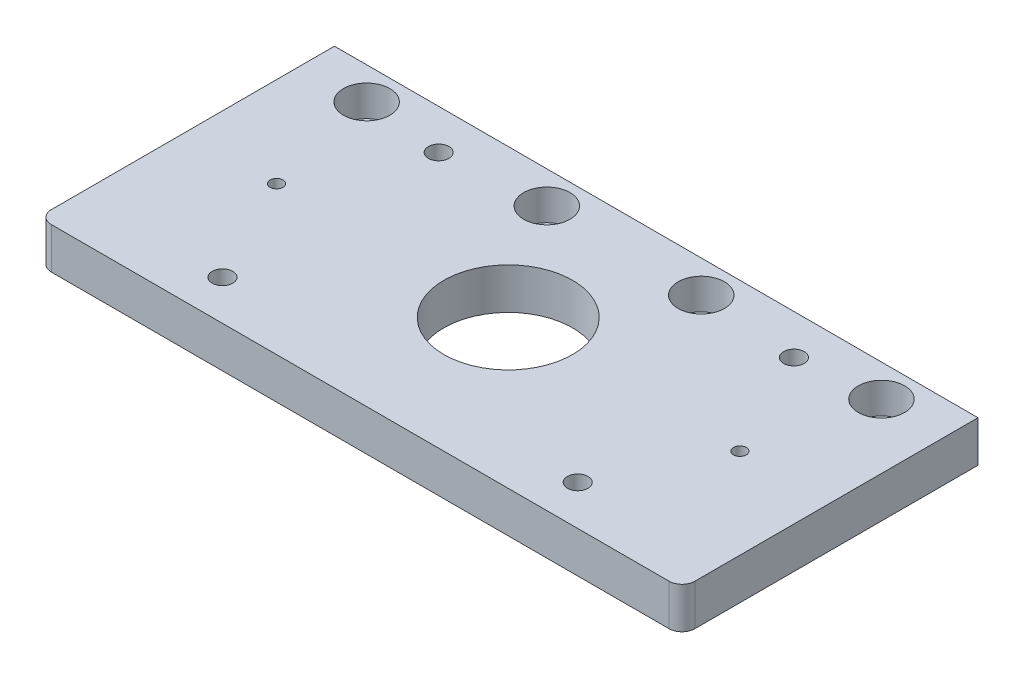
ISO-10303-21;
HEADER;
FILE_DESCRIPTION(('STEP AP214'),'2;1');
FILE_NAME('part.step','',(''),(''),'','','');
FILE_SCHEMA(('AUTOMOTIVE_DESIGN { 1 0 10303 214 1 1 1 1 }'));
ENDSEC;
DATA;
#1=APPLICATION_CONTEXT('core data for automotive mechanical design processes');
#2=APPLICATION_PROTOCOL_DEFINITION('international standard','automotive_design',2000,#1);
#3=PRODUCT_CONTEXT('',#1,'mechanical');
#4=PRODUCT('Part','Part','',(#3));
#5=PRODUCT_RELATED_PRODUCT_CATEGORY('part','',(#4));
#6=PRODUCT_DEFINITION_FORMATION('','',#4);
#7=PRODUCT_DEFINITION_CONTEXT('part definition',#1,'design');
#8=PRODUCT_DEFINITION('design','',#6,#7);
#9=PRODUCT_DEFINITION_SHAPE('','',#8);
#10=(LENGTH_UNIT() NAMED_UNIT(*) SI_UNIT(.MILLI.,.METRE.));
#11=(NAMED_UNIT(*) PLANE_ANGLE_UNIT() SI_UNIT($,.RADIAN.));
#12=(NAMED_UNIT(*) SI_UNIT($,.STERADIAN.) SOLID_ANGLE_UNIT());
#13=UNCERTAINTY_MEASURE_WITH_UNIT(LENGTH_MEASURE(1.E-05),#10,'distance_accuracy_value','');
#14=(GEOMETRIC_REPRESENTATION_CONTEXT(3) GLOBAL_UNCERTAINTY_ASSIGNED_CONTEXT((#13)) GLOBAL_UNIT_ASSIGNED_CONTEXT((#10,
#11,#12)) REPRESENTATION_CONTEXT('',''));
#15=CARTESIAN_POINT('',(0.,0.,0.));
#16=DIRECTION('',(0.,0.,1.));
#17=DIRECTION('',(1.,0.,0.));
#18=AXIS2_PLACEMENT_3D('',#15,#16,#17);
#19=CARTESIAN_POINT('',(90.,-25.,0.));
#20=DIRECTION('',(0.,1.,0.));
#21=DIRECTION('',(0.,0.,1.));
#22=AXIS2_PLACEMENT_3D('',#19,#20,#21);
#23=CYLINDRICAL_SURFACE('',#22,2.5);
#24=CARTESIAN_POINT('',(90.,16.,0.));
#25=DIRECTION('',(0.,1.,0.));
#26=DIRECTION('',(0.,0.,1.));
#27=AXIS2_PLACEMENT_3D('',#24,#25,#26);
#28=CIRCLE('',#27,2.5);
#29=CARTESIAN_POINT('',(90.,16.,2.5));
#30=VERTEX_POINT('',#29);
#31=EDGE_CURVE('E165',#30,#30,#28,.T.);
#32=CARTESIAN_POINT('',(90.,12.,0.));
#33=DIRECTION('',(0.,-1.,0.));
#34=DIRECTION('',(0.,0.,-1.));
#35=AXIS2_PLACEMENT_3D('',#32,#33,#34);
#36=CIRCLE('',#35,2.5);
#37=CARTESIAN_POINT('',(90.,12.,2.5));
#38=VERTEX_POINT('',#37);
#39=EDGE_CURVE('E45',#38,#38,#36,.F.);
#40=CARTESIAN_POINT('',(90.,16.,2.5));
#41=CARTESIAN_POINT('',(90.,15.9583333333333,2.5));
#42=CARTESIAN_POINT('',(90.,15.9166666666667,2.5));
#43=CARTESIAN_POINT('',(90.,15.8333333333333,2.5));
#44=CARTESIAN_POINT('',(90.,15.7916666666667,2.5));
#45=CARTESIAN_POINT('',(90.,15.7083333333333,2.5));
#46=CARTESIAN_POINT('',(90.,15.6666666666667,2.5));
#47=CARTESIAN_POINT('',(90.,15.5833333333333,2.5));
#48=CARTESIAN_POINT('',(90.,15.5416666666667,2.5));
#49=CARTESIAN_POINT('',(90.,15.4583333333333,2.5));
#50=CARTESIAN_POINT('',(90.,15.4166666666667,2.5));
#51=CARTESIAN_POINT('',(90.,15.3333333333333,2.5));
#52=CARTESIAN_POINT('',(90.,15.2916666666667,2.5));
#53=CARTESIAN_POINT('',(90.,15.2083333333333,2.5));
#54=CARTESIAN_POINT('',(90.,15.1666666666667,2.5));
#55=CARTESIAN_POINT('',(90.,15.0833333333333,2.5));
#56=CARTESIAN_POINT('',(90.,15.0416666666667,2.5));
#57=CARTESIAN_POINT('',(90.,14.9583333333333,2.5));
#58=CARTESIAN_POINT('',(90.,14.9166666666667,2.5));
#59=CARTESIAN_POINT('',(90.,14.8333333333333,2.5));
#60=CARTESIAN_POINT('',(90.,14.7916666666667,2.5));
#61=CARTESIAN_POINT('',(90.,14.7083333333333,2.5));
#62=CARTESIAN_POINT('',(90.,14.6666666666667,2.5));
#63=CARTESIAN_POINT('',(90.,14.5833333333333,2.5));
#64=CARTESIAN_POINT('',(90.,14.5416666666667,2.5));
#65=CARTESIAN_POINT('',(90.,14.4583333333333,2.5));
#66=CARTESIAN_POINT('',(90.,14.4166666666667,2.5));
#67=CARTESIAN_POINT('',(90.,14.3333333333333,2.5));
#68=CARTESIAN_POINT('',(90.,14.2916666666667,2.5));
#69=CARTESIAN_POINT('',(90.,14.2083333333333,2.5));
#70=CARTESIAN_POINT('',(90.,14.1666666666667,2.5));
#71=CARTESIAN_POINT('',(90.,14.0833333333333,2.5));
#72=CARTESIAN_POINT('',(90.,14.0416666666667,2.5));
#73=CARTESIAN_POINT('',(90.,13.9583333333333,2.5));
#74=CARTESIAN_POINT('',(90.,13.9166666666667,2.5));
#75=CARTESIAN_POINT('',(90.,13.8333333333333,2.5));
#76=CARTESIAN_POINT('',(90.,13.7916666666667,2.5));
#77=CARTESIAN_POINT('',(90.,13.7083333333333,2.5));
#78=CARTESIAN_POINT('',(90.,13.6666666666667,2.5));
#79=CARTESIAN_POINT('',(90.,13.5833333333333,2.5));
#80=CARTESIAN_POINT('',(90.,13.5416666666667,2.5));
#81=CARTESIAN_POINT('',(90.,13.4583333333333,2.5));
#82=CARTESIAN_POINT('',(90.,13.4166666666667,2.5));
#83=CARTESIAN_POINT('',(90.,13.3333333333333,2.5));
#84=CARTESIAN_POINT('',(90.,13.2916666666667,2.5));
#85=CARTESIAN_POINT('',(90.,13.2083333333333,2.5));
#86=CARTESIAN_POINT('',(90.,13.1666666666667,2.5));
#87=CARTESIAN_POINT('',(90.,13.0833333333333,2.5));
#88=CARTESIAN_POINT('',(90.,13.0416666666667,2.5));
#89=CARTESIAN_POINT('',(90.,12.9583333333333,2.5));
#90=CARTESIAN_POINT('',(90.,12.9166666666667,2.5));
#91=CARTESIAN_POINT('',(90.,12.8333333333333,2.5));
#92=CARTESIAN_POINT('',(90.,12.7916666666667,2.5));
#93=CARTESIAN_POINT('',(90.,12.7083333333333,2.5));
#94=CARTESIAN_POINT('',(90.,12.6666666666667,2.5));
#95=CARTESIAN_POINT('',(90.,12.5833333333333,2.5));
#96=CARTESIAN_POINT('',(90.,12.5416666666667,2.5));
#97=CARTESIAN_POINT('',(90.,12.4583333333333,2.5));
#98=CARTESIAN_POINT('',(90.,12.4166666666667,2.5));
#99=CARTESIAN_POINT('',(90.,12.3333333333333,2.5));
#100=CARTESIAN_POINT('',(90.,12.2916666666667,2.5));
#101=CARTESIAN_POINT('',(90.,12.2083333333333,2.5));
#102=CARTESIAN_POINT('',(90.,12.1666666666667,2.5));
#103=CARTESIAN_POINT('',(90.,12.0833333333333,2.5));
#104=CARTESIAN_POINT('',(90.,12.0416666666667,2.5));
#105=CARTESIAN_POINT('',(90.,12.,2.5));
#106=B_SPLINE_CURVE_WITH_KNOTS('',3,(#40,#41,#42,#43,#44,#45,#46,#47,#48,#49,#50,#51,#52,#53,
#54,#55,#56,#57,#58,#59,#60,#61,#62,#63,#64,#65,#66,#67,#68,#69,#70,#71,#72,#73,#74,#75,#76,#77,
#78,#79,#80,#81,#82,#83,#84,#85,#86,#87,#88,#89,#90,#91,#92,#93,#94,#95,#96,#97,#98,#99,#100,
#101,#102,#103,#104,#105),.UNSPECIFIED.,.F.,.F.,(4,2,2,2,2,2,2,2,2,2,2,2,2,2,2,2,2,2,2,2,2,2,2,
2,2,2,2,2,2,2,2,2,4),(0.,0.125,0.25,0.375,0.5,0.625000000000001,0.750000000000001,
0.875000000000001,1.,1.12499999999999,1.24999999999999,1.37499999999999,1.49999999999999,
1.62499999999999,1.74999999999999,1.87499999999999,1.99999999999999,2.125,2.25,2.375,2.5,2.625,
2.75,2.875,2.99999999999999,3.12499999999999,3.24999999999999,3.37499999999999,3.49999999999999,
3.62499999999999,3.74999999999999,3.87499999999999,3.99999999999999),.UNSPECIFIED.);
#107=EDGE_CURVE('BSEAM41',#30,#38,#106,.T.);
#108=ORIENTED_EDGE('',*,*,#31,.T.);
#109=ORIENTED_EDGE('',*,*,#39,.F.);
#110=ORIENTED_EDGE('',*,*,#107,.T.);
#111=ORIENTED_EDGE('',*,*,#107,.F.);
#112=EDGE_LOOP('',(#108,#110,#109,#111));
#113=FACE_BOUND('',#112,.T.);
#114=ADVANCED_FACE('F41',(#113),#23,.F.);
#115=CARTESIAN_POINT('',(-90.,-25.,0.));
#116=DIRECTION('',(0.,1.,0.));
#117=DIRECTION('',(0.,0.,1.));
#118=AXIS2_PLACEMENT_3D('',#115,#116,#117);
#119=CYLINDRICAL_SURFACE('',#118,2.5);
#120=CARTESIAN_POINT('',(-90.,16.,0.));
#121=DIRECTION('',(0.,1.,0.));
#122=DIRECTION('',(0.,0.,1.));
#123=AXIS2_PLACEMENT_3D('',#120,#121,#122);
#124=CIRCLE('',#123,2.5);
#125=CARTESIAN_POINT('',(-90.,16.,2.50000000000001));
#126=VERTEX_POINT('',#125);
#127=EDGE_CURVE('E180',#126,#126,#124,.T.);
#128=CARTESIAN_POINT('',(-90.,12.,0.));
#129=DIRECTION('',(0.,-1.,0.));
#130=DIRECTION('',(0.,0.,-1.));
#131=AXIS2_PLACEMENT_3D('',#128,#129,#130);
#132=CIRCLE('',#131,2.5);
#133=CARTESIAN_POINT('',(-90.,12.,2.50000000000001));
#134=VERTEX_POINT('',#133);
#135=EDGE_CURVE('E159',#134,#134,#132,.F.);
#136=CARTESIAN_POINT('',(-90.,16.,2.50000000000001));
#137=CARTESIAN_POINT('',(-90.,15.9583333333333,2.50000000000001));
#138=CARTESIAN_POINT('',(-90.,15.9166666666667,2.50000000000001));
#139=CARTESIAN_POINT('',(-90.,15.8333333333333,2.50000000000001));
#140=CARTESIAN_POINT('',(-90.,15.7916666666667,2.50000000000001));
#141=CARTESIAN_POINT('',(-90.,15.7083333333333,2.50000000000001));
#142=CARTESIAN_POINT('',(-90.,15.6666666666667,2.50000000000001));
#143=CARTESIAN_POINT('',(-90.,15.5833333333333,2.50000000000001));
#144=CARTESIAN_POINT('',(-90.,15.5416666666667,2.50000000000001));
#145=CARTESIAN_POINT('',(-90.,15.4583333333333,2.50000000000001));
#146=CARTESIAN_POINT('',(-90.,15.4166666666667,2.50000000000001));
#147=CARTESIAN_POINT('',(-90.,15.3333333333333,2.50000000000001));
#148=CARTESIAN_POINT('',(-90.,15.2916666666667,2.50000000000001));
#149=CARTESIAN_POINT('',(-90.,15.2083333333333,2.50000000000001));
#150=CARTESIAN_POINT('',(-90.,15.1666666666667,2.50000000000001));
#151=CARTESIAN_POINT('',(-90.,15.0833333333333,2.50000000000001));
#152=CARTESIAN_POINT('',(-90.,15.0416666666667,2.50000000000001));
#153=CARTESIAN_POINT('',(-90.,14.9583333333333,2.50000000000001));
#154=CARTESIAN_POINT('',(-90.,14.9166666666667,2.50000000000001));
#155=CARTESIAN_POINT('',(-90.,14.8333333333333,2.50000000000001));
#156=CARTESIAN_POINT('',(-90.,14.7916666666667,2.50000000000001));
#157=CARTESIAN_POINT('',(-90.,14.7083333333333,2.50000000000001));
#158=CARTESIAN_POINT('',(-90.,14.6666666666667,2.50000000000001));
#159=CARTESIAN_POINT('',(-90.,14.5833333333333,2.50000000000001));
#160=CARTESIAN_POINT('',(-90.,14.5416666666667,2.50000000000001));
#161=CARTESIAN_POINT('',(-90.,14.4583333333333,2.50000000000001));
#162=CARTESIAN_POINT('',(-90.,14.4166666666667,2.50000000000001));
#163=CARTESIAN_POINT('',(-90.,14.3333333333333,2.50000000000001));
#164=CARTESIAN_POINT('',(-90.,14.2916666666667,2.50000000000001));
#165=CARTESIAN_POINT('',(-90.,14.2083333333333,2.50000000000001));
#166=CARTESIAN_POINT('',(-90.,14.1666666666667,2.50000000000001));
#167=CARTESIAN_POINT('',(-90.,14.0833333333333,2.50000000000001));
#168=CARTESIAN_POINT('',(-90.,14.0416666666667,2.50000000000001));
#169=CARTESIAN_POINT('',(-90.,13.9583333333333,2.50000000000001));
#170=CARTESIAN_POINT('',(-90.,13.9166666666667,2.50000000000001));
#171=CARTESIAN_POINT('',(-90.,13.8333333333333,2.50000000000001));
#172=CARTESIAN_POINT('',(-90.,13.7916666666667,2.50000000000001));
#173=CARTESIAN_POINT('',(-90.,13.7083333333333,2.50000000000001));
#174=CARTESIAN_POINT('',(-90.,13.6666666666667,2.50000000000001));
#175=CARTESIAN_POINT('',(-90.,13.5833333333333,2.50000000000001));
#176=CARTESIAN_POINT('',(-90.,13.5416666666667,2.50000000000001));
#177=CARTESIAN_POINT('',(-90.,13.4583333333333,2.50000000000001));
#178=CARTESIAN_POINT('',(-90.,13.4166666666667,2.50000000000001));
#179=CARTESIAN_POINT('',(-90.,13.3333333333333,2.50000000000001));
#180=CARTESIAN_POINT('',(-90.,13.2916666666667,2.50000000000001));
#181=CARTESIAN_POINT('',(-90.,13.2083333333333,2.50000000000001));
#182=CARTESIAN_POINT('',(-90.,13.1666666666667,2.50000000000001));
#183=CARTESIAN_POINT('',(-90.,13.0833333333333,2.50000000000001));
#184=CARTESIAN_POINT('',(-90.,13.0416666666667,2.50000000000001));
#185=CARTESIAN_POINT('',(-90.,12.9583333333333,2.50000000000001));
#186=CARTESIAN_POINT('',(-90.,12.9166666666667,2.50000000000001));
#187=CARTESIAN_POINT('',(-90.,12.8333333333333,2.50000000000001));
#188=CARTESIAN_POINT('',(-90.,12.7916666666667,2.50000000000001));
#189=CARTESIAN_POINT('',(-90.,12.7083333333333,2.50000000000001));
#190=CARTESIAN_POINT('',(-90.,12.6666666666667,2.50000000000001));
#191=CARTESIAN_POINT('',(-90.,12.5833333333333,2.50000000000001));
#192=CARTESIAN_POINT('',(-90.,12.5416666666667,2.50000000000001));
#193=CARTESIAN_POINT('',(-90.,12.4583333333333,2.50000000000001));
#194=CARTESIAN_POINT('',(-90.,12.4166666666667,2.50000000000001));
#195=CARTESIAN_POINT('',(-90.,12.3333333333333,2.50000000000001));
#196=CARTESIAN_POINT('',(-90.,12.2916666666667,2.50000000000001));
#197=CARTESIAN_POINT('',(-90.,12.2083333333333,2.50000000000001));
#198=CARTESIAN_POINT('',(-90.,12.1666666666667,2.50000000000001));
#199=CARTESIAN_POINT('',(-90.,12.0833333333333,2.50000000000001));
#200=CARTESIAN_POINT('',(-90.,12.0416666666667,2.50000000000001));
#201=CARTESIAN_POINT('',(-90.,12.,2.50000000000001));
#202=B_SPLINE_CURVE_WITH_KNOTS('',3,(#136,#137,#138,#139,#140,#141,#142,#143,#144,#145,#146,
#147,#148,#149,#150,#151,#152,#153,#154,#155,#156,#157,#158,#159,#160,#161,#162,#163,#164,#165,
#166,#167,#168,#169,#170,#171,#172,#173,#174,#175,#176,#177,#178,#179,#180,#181,#182,#183,#184,
#185,#186,#187,#188,#189,#190,#191,#192,#193,#194,#195,#196,#197,#198,#199,#200,#201),
.UNSPECIFIED.,.F.,.F.,(4,2,2,2,2,2,2,2,2,2,2,2,2,2,2,2,2,2,2,2,2,2,2,2,2,2,2,2,2,2,2,2,4),(0.,
0.125,0.25,0.375,0.5,0.625000000000001,0.750000000000001,0.875000000000001,1.,1.12499999999999,
1.24999999999999,1.37499999999999,1.49999999999999,1.62499999999999,1.74999999999999,
1.87499999999999,1.99999999999999,2.125,2.25,2.375,2.5,2.625,2.75,2.875,2.99999999999999,
3.12499999999999,3.24999999999999,3.37499999999999,3.49999999999999,3.62499999999999,
3.74999999999999,3.87499999999999,3.99999999999999),.UNSPECIFIED.);
#203=EDGE_CURVE('BSEAM274',#126,#134,#202,.T.);
#204=ORIENTED_EDGE('',*,*,#127,.T.);
#205=ORIENTED_EDGE('',*,*,#135,.F.);
#206=ORIENTED_EDGE('',*,*,#203,.T.);
#207=ORIENTED_EDGE('',*,*,#203,.F.);
#208=EDGE_LOOP('',(#204,#206,#205,#207));
#209=FACE_BOUND('',#208,.T.);
#210=ADVANCED_FACE('F274',(#209),#119,.F.);
#211=CARTESIAN_POINT('',(-100.,16.,-45.));
#212=DIRECTION('',(0.,-1.,0.));
#213=DIRECTION('',(0.,0.,-1.));
#214=AXIS2_PLACEMENT_3D('',#211,#212,#213);
#215=CYLINDRICAL_SURFACE('',#214,6.);
#216=CARTESIAN_POINT('',(-100.,0.,-45.));
#217=DIRECTION('',(0.,1.,0.));
#218=DIRECTION('',(0.,0.,-1.));
#219=AXIS2_PLACEMENT_3D('',#216,#217,#218);
#220=CIRCLE('',#219,6.);
#221=CARTESIAN_POINT('',(-100.,0.,-51.));
#222=VERTEX_POINT('',#221);
#223=EDGE_CURVE('E210',#222,#222,#220,.T.);
#224=ORIENTED_EDGE('',*,*,#223,.F.);
#225=EDGE_LOOP('',(#224));
#226=FACE_BOUND('',#225,.T.);
#227=CARTESIAN_POINT('',(-100.,4.,-45.));
#228=DIRECTION('',(0.,1.,0.));
#229=DIRECTION('',(0.,0.,1.));
#230=AXIS2_PLACEMENT_3D('',#227,#228,#229);
#231=CIRCLE('',#230,6.);
#232=CARTESIAN_POINT('',(-100.,4.,-39.));
#233=VERTEX_POINT('',#232);
#234=EDGE_CURVE('E149',#233,#233,#231,.T.);
#235=ORIENTED_EDGE('',*,*,#234,.T.);
#236=EDGE_LOOP('',(#235));
#237=FACE_BOUND('',#236,.T.);
#238=ADVANCED_FACE('F281',(#226,#237),#215,.F.);
#239=CARTESIAN_POINT('',(-30.,16.,-45.));
#240=DIRECTION('',(0.,-1.,0.));
#241=DIRECTION('',(0.,0.,-1.));
#242=AXIS2_PLACEMENT_3D('',#239,#240,#241);
#243=CYLINDRICAL_SURFACE('',#242,6.);
#244=CARTESIAN_POINT('',(-30.,0.,-45.));
#245=DIRECTION('',(0.,1.,0.));
#246=DIRECTION('',(0.,0.,-1.));
#247=AXIS2_PLACEMENT_3D('',#244,#245,#246);
#248=CIRCLE('',#247,6.);
#249=CARTESIAN_POINT('',(-30.,0.,-51.));
#250=VERTEX_POINT('',#249);
#251=EDGE_CURVE('E158',#250,#250,#248,.T.);
#252=ORIENTED_EDGE('',*,*,#251,.F.);
#253=EDGE_LOOP('',(#252));
#254=FACE_BOUND('',#253,.T.);
#255=CARTESIAN_POINT('',(-30.,4.,-45.));
#256=DIRECTION('',(0.,1.,0.));
#257=DIRECTION('',(0.,0.,1.));
#258=AXIS2_PLACEMENT_3D('',#255,#256,#257);
#259=CIRCLE('',#258,6.);
#260=CARTESIAN_POINT('',(-30.,4.,-39.));
#261=VERTEX_POINT('',#260);
#262=EDGE_CURVE('E146',#261,#261,#259,.T.);
#263=ORIENTED_EDGE('',*,*,#262,.T.);
#264=EDGE_LOOP('',(#263));
#265=FACE_BOUND('',#264,.T.);
#266=ADVANCED_FACE('F321',(#254,#265),#243,.F.);
#267=CARTESIAN_POINT('',(-120.,16.,52.5));
#268=DIRECTION('',(0.,1.,0.));
#269=DIRECTION('',(0.,0.,1.));
#270=AXIS2_PLACEMENT_3D('',#267,#268,#269);
#271=PLANE('',#270);
#272=ORIENTED_EDGE('',*,*,#127,.F.);
#273=EDGE_LOOP('',(#272));
#274=FACE_BOUND('',#273,.T.);
#275=ORIENTED_EDGE('',*,*,#31,.F.);
#276=EDGE_LOOP('',(#275));
#277=FACE_BOUND('',#276,.T.);
#278=CARTESIAN_POINT('',(-100.,16.,-45.));
#279=DIRECTION('',(0.,1.,0.));
#280=DIRECTION('',(0.,0.,1.));
#281=AXIS2_PLACEMENT_3D('',#278,#279,#280);
#282=CIRCLE('',#281,9.);
#283=CARTESIAN_POINT('',(-100.,16.,-36.));
#284=VERTEX_POINT('',#283);
#285=EDGE_CURVE('E188',#284,#284,#282,.T.);
#286=ORIENTED_EDGE('',*,*,#285,.F.);
#287=EDGE_LOOP('',(#286));
#288=FACE_BOUND('',#287,.T.);
#289=CARTESIAN_POINT('',(-30.,16.,-45.));
#290=DIRECTION('',(0.,1.,0.));
#291=DIRECTION('',(0.,0.,1.));
#292=AXIS2_PLACEMENT_3D('',#289,#290,#291);
#293=CIRCLE('',#292,9.);
#294=CARTESIAN_POINT('',(-30.,16.,-36.));
#295=VERTEX_POINT('',#294);
#296=EDGE_CURVE('E191',#295,#295,#293,.T.);
#297=ORIENTED_EDGE('',*,*,#296,.F.);
#298=EDGE_LOOP('',(#297));
#299=FACE_BOUND('',#298,.T.);
#300=CARTESIAN_POINT('',(30.,16.,-45.));
#301=DIRECTION('',(0.,1.,0.));
#302=DIRECTION('',(0.,0.,-1.));
#303=AXIS2_PLACEMENT_3D('',#300,#301,#302);
#304=CIRCLE('',#303,9.);
#305=CARTESIAN_POINT('',(30.,16.,-54.));
#306=VERTEX_POINT('',#305);
#307=EDGE_CURVE('E197',#306,#306,#304,.T.);
#308=ORIENTED_EDGE('',*,*,#307,.F.);
#309=EDGE_LOOP('',(#308));
#310=FACE_BOUND('',#309,.T.);
#311=CARTESIAN_POINT('',(100.,16.,-45.));
#312=DIRECTION('',(0.,1.,0.));
#313=DIRECTION('',(0.,0.,-1.));
#314=AXIS2_PLACEMENT_3D('',#311,#312,#313);
#315=CIRCLE('',#314,9.);
#316=CARTESIAN_POINT('',(100.,16.,-54.));
#317=VERTEX_POINT('',#316);
#318=EDGE_CURVE('E203',#317,#317,#315,.T.);
#319=ORIENTED_EDGE('',*,*,#318,.F.);
#320=EDGE_LOOP('',(#319));
#321=FACE_BOUND('',#320,.T.);
#322=CARTESIAN_POINT('',(-69.,16.,42.));
#323=DIRECTION('',(0.,1.,0.));
#324=DIRECTION('',(0.,0.,-1.));
#325=AXIS2_PLACEMENT_3D('',#322,#323,#324);
#326=CIRCLE('',#325,4.00000000000001);
#327=CARTESIAN_POINT('',(-69.,16.,38.));
#328=VERTEX_POINT('',#327);
#329=EDGE_CURVE('E226',#328,#328,#326,.T.);
#330=ORIENTED_EDGE('',*,*,#329,.F.);
#331=EDGE_LOOP('',(#330));
#332=FACE_BOUND('',#331,.T.);
#333=CARTESIAN_POINT('',(69.,16.,42.));
#334=DIRECTION('',(0.,1.,0.));
#335=DIRECTION('',(0.,0.,1.));
#336=AXIS2_PLACEMENT_3D('',#333,#334,#335);
#337=CIRCLE('',#336,4.00000000000001);
#338=CARTESIAN_POINT('',(69.,16.,46.));
#339=VERTEX_POINT('',#338);
#340=EDGE_CURVE('E238',#339,#339,#337,.T.);
#341=ORIENTED_EDGE('',*,*,#340,.F.);
#342=EDGE_LOOP('',(#341));
#343=FACE_BOUND('',#342,.T.);
#344=DIRECTION('',(0.,0.,1.));
#345=VECTOR('',#344,1.);
#346=CARTESIAN_POINT('',(-125.,16.,-57.5));
#347=LINE('',#346,#345);
#348=CARTESIAN_POINT('',(-125.,16.,-57.5));
#349=VERTEX_POINT('',#348);
#350=CARTESIAN_POINT('',(-125.,16.,52.5));
#351=VERTEX_POINT('',#350);
#352=EDGE_CURVE('E140',#349,#351,#347,.T.);
#353=ORIENTED_EDGE('',*,*,#352,.T.);
#354=CARTESIAN_POINT('',(-120.,16.,52.5));
#355=DIRECTION('',(0.,1.,0.));
#356=DIRECTION('',(0.,0.,1.));
#357=AXIS2_PLACEMENT_3D('',#354,#355,#356);
#358=CIRCLE('',#357,5.);
#359=CARTESIAN_POINT('',(-120.,16.,57.5));
#360=VERTEX_POINT('',#359);
#361=EDGE_CURVE('E97',#351,#360,#358,.T.);
#362=ORIENTED_EDGE('',*,*,#361,.T.);
#363=DIRECTION('',(1.,0.,0.));
#364=VECTOR('',#363,1.);
#365=CARTESIAN_POINT('',(-120.,16.,57.5));
#366=LINE('',#365,#364);
#367=CARTESIAN_POINT('',(120.,16.,57.5));
#368=VERTEX_POINT('',#367);
#369=EDGE_CURVE('E111',#360,#368,#366,.T.);
#370=ORIENTED_EDGE('',*,*,#369,.T.);
#371=CARTESIAN_POINT('',(120.,16.,52.5));
#372=DIRECTION('',(0.,1.,0.));
#373=DIRECTION('',(0.,0.,1.));
#374=AXIS2_PLACEMENT_3D('',#371,#372,#373);
#375=CIRCLE('',#374,5.);
#376=CARTESIAN_POINT('',(125.,16.,52.5));
#377=VERTEX_POINT('',#376);
#378=EDGE_CURVE('E104',#368,#377,#375,.T.);
#379=ORIENTED_EDGE('',*,*,#378,.T.);
#380=DIRECTION('',(0.,0.,-1.));
#381=VECTOR('',#380,1.);
#382=CARTESIAN_POINT('',(125.,16.,-57.5));
#383=LINE('',#382,#381);
#384=CARTESIAN_POINT('',(125.,16.,-57.5));
#385=VERTEX_POINT('',#384);
#386=EDGE_CURVE('E109',#377,#385,#383,.T.);
#387=ORIENTED_EDGE('',*,*,#386,.T.);
#388=DIRECTION('',(-1.,0.,0.));
#389=VECTOR('',#388,1.);
#390=CARTESIAN_POINT('',(-125.,16.,-57.5));
#391=LINE('',#390,#389);
#392=EDGE_CURVE('E60',#385,#349,#391,.T.);
#393=ORIENTED_EDGE('',*,*,#392,.T.);
#394=EDGE_LOOP('',(#353,#362,#370,#379,#387,#393));
#395=FACE_BOUND('',#394,.T.);
#396=CARTESIAN_POINT('',(0.,16.,0.));
#397=DIRECTION('',(0.,1.,0.));
#398=DIRECTION('',(0.,0.,1.));
#399=AXIS2_PLACEMENT_3D('',#396,#397,#398);
#400=CIRCLE('',#399,25.);
#401=CARTESIAN_POINT('',(0.,16.,25.));
#402=VERTEX_POINT('',#401);
#403=EDGE_CURVE('E133',#402,#402,#400,.T.);
#404=ORIENTED_EDGE('',*,*,#403,.F.);
#405=EDGE_LOOP('',(#404));
#406=FACE_BOUND('',#405,.T.);
#407=CARTESIAN_POINT('',(69.,16.,-42.));
#408=DIRECTION('',(0.,1.,0.));
#409=DIRECTION('',(0.,0.,-1.));
#410=AXIS2_PLACEMENT_3D('',#407,#408,#409);
#411=CIRCLE('',#410,4.00000000000001);
#412=CARTESIAN_POINT('',(69.,16.,-46.));
#413=VERTEX_POINT('',#412);
#414=EDGE_CURVE('E232',#413,#413,#411,.T.);
#415=ORIENTED_EDGE('',*,*,#414,.F.);
#416=EDGE_LOOP('',(#415));
#417=FACE_BOUND('',#416,.T.);
#418=CARTESIAN_POINT('',(-69.,16.,-42.));
#419=DIRECTION('',(0.,1.,0.));
#420=DIRECTION('',(0.,0.,1.));
#421=AXIS2_PLACEMENT_3D('',#418,#419,#420);
#422=CIRCLE('',#421,4.00000000000001);
#423=CARTESIAN_POINT('',(-69.,16.,-38.));
#424=VERTEX_POINT('',#423);
#425=EDGE_CURVE('E220',#424,#424,#422,.T.);
#426=ORIENTED_EDGE('',*,*,#425,.F.);
#427=EDGE_LOOP('',(#426));
#428=FACE_BOUND('',#427,.T.);
#429=ADVANCED_FACE('F106',(#274,#277,#288,#299,#310,#321,#332,#343,#395,#406,#417,#428),#271,.T.);
#430=CARTESIAN_POINT('',(-120.,0.,52.5));
#431=DIRECTION('',(0.,1.,0.));
#432=DIRECTION('',(0.,0.,1.));
#433=AXIS2_PLACEMENT_3D('',#430,#431,#432);
#434=PLANE('',#433);
#435=CARTESIAN_POINT('',(-90.,0.,0.));
#436=DIRECTION('',(0.,-1.,0.));
#437=DIRECTION('',(0.,0.,-1.));
#438=AXIS2_PLACEMENT_3D('',#435,#436,#437);
#439=CIRCLE('',#438,12.5);
#440=CARTESIAN_POINT('',(-90.,0.,-12.5));
#441=VERTEX_POINT('',#440);
#442=EDGE_CURVE('E167',#441,#441,#439,.T.);
#443=ORIENTED_EDGE('',*,*,#442,.F.);
#444=EDGE_LOOP('',(#443));
#445=FACE_BOUND('',#444,.T.);
#446=CARTESIAN_POINT('',(90.,0.,0.));
#447=DIRECTION('',(0.,-1.,0.));
#448=DIRECTION('',(0.,0.,-1.));
#449=AXIS2_PLACEMENT_3D('',#446,#447,#448);
#450=CIRCLE('',#449,12.5);
#451=CARTESIAN_POINT('',(90.,0.,-12.5));
#452=VERTEX_POINT('',#451);
#453=EDGE_CURVE('E172',#452,#452,#450,.T.);
#454=ORIENTED_EDGE('',*,*,#453,.F.);
#455=EDGE_LOOP('',(#454));
#456=FACE_BOUND('',#455,.T.);
#457=DIRECTION('',(0.,0.,1.));
#458=VECTOR('',#457,1.);
#459=CARTESIAN_POINT('',(-125.,0.,-57.5));
#460=LINE('',#459,#458);
#461=CARTESIAN_POINT('',(-125.,0.,-57.5));
#462=VERTEX_POINT('',#461);
#463=CARTESIAN_POINT('',(-125.,0.,52.5));
#464=VERTEX_POINT('',#463);
#465=EDGE_CURVE('E129',#462,#464,#460,.T.);
#466=ORIENTED_EDGE('',*,*,#465,.F.);
#467=DIRECTION('',(-1.,0.,0.));
#468=VECTOR('',#467,1.);
#469=CARTESIAN_POINT('',(-125.,0.,-57.5));
#470=LINE('',#469,#468);
#471=CARTESIAN_POINT('',(125.,0.,-57.5));
#472=VERTEX_POINT('',#471);
#473=EDGE_CURVE('E89',#472,#462,#470,.T.);
#474=ORIENTED_EDGE('',*,*,#473,.F.);
#475=DIRECTION('',(0.,0.,-1.));
#476=VECTOR('',#475,1.);
#477=CARTESIAN_POINT('',(125.,0.,-57.5));
#478=LINE('',#477,#476);
#479=CARTESIAN_POINT('',(125.,0.,52.5));
#480=VERTEX_POINT('',#479);
#481=EDGE_CURVE('E83',#480,#472,#478,.T.);
#482=ORIENTED_EDGE('',*,*,#481,.F.);
#483=CARTESIAN_POINT('',(120.,0.,52.5));
#484=DIRECTION('',(0.,1.,0.));
#485=DIRECTION('',(0.,0.,1.));
#486=AXIS2_PLACEMENT_3D('',#483,#484,#485);
#487=CIRCLE('',#486,5.);
#488=CARTESIAN_POINT('',(120.,0.,57.5));
#489=VERTEX_POINT('',#488);
#490=EDGE_CURVE('E119',#489,#480,#487,.T.);
#491=ORIENTED_EDGE('',*,*,#490,.F.);
#492=DIRECTION('',(1.,0.,0.));
#493=VECTOR('',#492,1.);
#494=CARTESIAN_POINT('',(-120.,0.,57.5));
#495=LINE('',#494,#493);
#496=CARTESIAN_POINT('',(-120.,0.,57.5));
#497=VERTEX_POINT('',#496);
#498=EDGE_CURVE('E135',#497,#489,#495,.T.);
#499=ORIENTED_EDGE('',*,*,#498,.F.);
#500=CARTESIAN_POINT('',(-120.,0.,52.5));
#501=DIRECTION('',(0.,1.,0.));
#502=DIRECTION('',(0.,0.,1.));
#503=AXIS2_PLACEMENT_3D('',#500,#501,#502);
#504=CIRCLE('',#503,5.);
#505=EDGE_CURVE('E132',#464,#497,#504,.T.);
#506=ORIENTED_EDGE('',*,*,#505,.F.);
#507=EDGE_LOOP('',(#466,#474,#482,#491,#499,#506));
#508=FACE_BOUND('',#507,.T.);
#509=CARTESIAN_POINT('',(0.,0.,0.));
#510=DIRECTION('',(0.,1.,0.));
#511=DIRECTION('',(0.,0.,1.));
#512=AXIS2_PLACEMENT_3D('',#509,#510,#511);
#513=CIRCLE('',#512,25.);
#514=CARTESIAN_POINT('',(0.,0.,25.));
#515=VERTEX_POINT('',#514);
#516=EDGE_CURVE('E241',#515,#515,#513,.T.);
#517=ORIENTED_EDGE('',*,*,#516,.T.);
#518=EDGE_LOOP('',(#517));
#519=FACE_BOUND('',#518,.T.);
#520=CARTESIAN_POINT('',(69.,0.,42.));
#521=DIRECTION('',(0.,1.,0.));
#522=DIRECTION('',(0.,0.,1.));
#523=AXIS2_PLACEMENT_3D('',#520,#521,#522);
#524=CIRCLE('',#523,4.00000000000001);
#525=CARTESIAN_POINT('',(69.,0.,46.));
#526=VERTEX_POINT('',#525);
#527=EDGE_CURVE('E235',#526,#526,#524,.T.);
#528=ORIENTED_EDGE('',*,*,#527,.T.);
#529=EDGE_LOOP('',(#528));
#530=FACE_BOUND('',#529,.T.);
#531=CARTESIAN_POINT('',(69.,0.,-42.));
#532=DIRECTION('',(0.,1.,0.));
#533=DIRECTION('',(0.,0.,-1.));
#534=AXIS2_PLACEMENT_3D('',#531,#532,#533);
#535=CIRCLE('',#534,4.00000000000001);
#536=CARTESIAN_POINT('',(69.,0.,-46.));
#537=VERTEX_POINT('',#536);
#538=EDGE_CURVE('E229',#537,#537,#535,.T.);
#539=ORIENTED_EDGE('',*,*,#538,.T.);
#540=EDGE_LOOP('',(#539));
#541=FACE_BOUND('',#540,.T.);
#542=CARTESIAN_POINT('',(-69.,0.,42.));
#543=DIRECTION('',(0.,1.,0.));
#544=DIRECTION('',(0.,0.,-1.));
#545=AXIS2_PLACEMENT_3D('',#542,#543,#544);
#546=CIRCLE('',#545,4.00000000000001);
#547=CARTESIAN_POINT('',(-69.,0.,38.));
#548=VERTEX_POINT('',#547);
#549=EDGE_CURVE('E223',#548,#548,#546,.T.);
#550=ORIENTED_EDGE('',*,*,#549,.T.);
#551=EDGE_LOOP('',(#550));
#552=FACE_BOUND('',#551,.T.);
#553=CARTESIAN_POINT('',(-69.,0.,-42.));
#554=DIRECTION('',(0.,1.,0.));
#555=DIRECTION('',(0.,0.,1.));
#556=AXIS2_PLACEMENT_3D('',#553,#554,#555);
#557=CIRCLE('',#556,4.00000000000001);
#558=CARTESIAN_POINT('',(-69.,0.,-38.));
#559=VERTEX_POINT('',#558);
#560=EDGE_CURVE('E219',#559,#559,#557,.T.);
#561=ORIENTED_EDGE('',*,*,#560,.T.);
#562=EDGE_LOOP('',(#561));
#563=FACE_BOUND('',#562,.T.);
#564=CARTESIAN_POINT('',(30.,0.,-45.));
#565=DIRECTION('',(0.,1.,0.));
#566=DIRECTION('',(0.,0.,1.));
#567=AXIS2_PLACEMENT_3D('',#564,#565,#566);
#568=CIRCLE('',#567,6.);
#569=CARTESIAN_POINT('',(30.,0.,-39.));
#570=VERTEX_POINT('',#569);
#571=EDGE_CURVE('E216',#570,#570,#568,.T.);
#572=ORIENTED_EDGE('',*,*,#571,.T.);
#573=EDGE_LOOP('',(#572));
#574=FACE_BOUND('',#573,.T.);
#575=CARTESIAN_POINT('',(100.,0.,-45.));
#576=DIRECTION('',(0.,1.,0.));
#577=DIRECTION('',(0.,0.,1.));
#578=AXIS2_PLACEMENT_3D('',#575,#576,#577);
#579=CIRCLE('',#578,6.);
#580=CARTESIAN_POINT('',(100.,0.,-39.));
#581=VERTEX_POINT('',#580);
#582=EDGE_CURVE('E213',#581,#581,#579,.T.);
#583=ORIENTED_EDGE('',*,*,#582,.T.);
#584=EDGE_LOOP('',(#583));
#585=FACE_BOUND('',#584,.T.);
#586=ORIENTED_EDGE('',*,*,#223,.T.);
#587=EDGE_LOOP('',(#586));
#588=FACE_BOUND('',#587,.T.);
#589=ORIENTED_EDGE('',*,*,#251,.T.);
#590=EDGE_LOOP('',(#589));
#591=FACE_BOUND('',#590,.T.);
#592=ADVANCED_FACE('F257',(#445,#456,#508,#519,#530,#541,#552,#563,#574,#585,#588,#591),#434,.F.);
#593=CARTESIAN_POINT('',(-125.,16.,-57.5));
#594=DIRECTION('',(1.,0.,0.));
#595=DIRECTION('',(0.,0.,-1.));
#596=AXIS2_PLACEMENT_3D('',#593,#594,#595);
#597=PLANE('',#596);
#598=ORIENTED_EDGE('',*,*,#465,.T.);
#599=DIRECTION('',(0.,-1.,0.));
#600=VECTOR('',#599,1.);
#601=CARTESIAN_POINT('',(-125.,16.,52.5));
#602=LINE('',#601,#600);
#603=EDGE_CURVE('E11',#351,#464,#602,.T.);
#604=ORIENTED_EDGE('',*,*,#603,.F.);
#605=ORIENTED_EDGE('',*,*,#352,.F.);
#606=DIRECTION('',(0.,-1.,0.));
#607=VECTOR('',#606,1.);
#608=CARTESIAN_POINT('',(-125.,16.,-57.5));
#609=LINE('',#608,#607);
#610=EDGE_CURVE('E125',#349,#462,#609,.T.);
#611=ORIENTED_EDGE('',*,*,#610,.T.);
#612=EDGE_LOOP('',(#598,#604,#605,#611));
#613=FACE_BOUND('',#612,.T.);
#614=ADVANCED_FACE('F43',(#613),#597,.F.);
#615=CARTESIAN_POINT('',(-120.,16.,52.5));
#616=DIRECTION('',(0.,-1.,0.));
#617=DIRECTION('',(0.,0.,-1.));
#618=AXIS2_PLACEMENT_3D('',#615,#616,#617);
#619=CYLINDRICAL_SURFACE('',#618,5.);
#620=ORIENTED_EDGE('',*,*,#505,.T.);
#621=DIRECTION('',(0.,-1.,0.));
#622=VECTOR('',#621,1.);
#623=CARTESIAN_POINT('',(-120.,16.,57.5));
#624=LINE('',#623,#622);
#625=EDGE_CURVE('E51',#360,#497,#624,.T.);
#626=ORIENTED_EDGE('',*,*,#625,.F.);
#627=ORIENTED_EDGE('',*,*,#361,.F.);
#628=ORIENTED_EDGE('',*,*,#603,.T.);
#629=EDGE_LOOP('',(#620,#626,#627,#628));
#630=FACE_BOUND('',#629,.T.);
#631=ADVANCED_FACE('F251',(#630),#619,.T.);
#632=CARTESIAN_POINT('',(-120.,16.,57.5));
#633=DIRECTION('',(0.,0.,-1.));
#634=DIRECTION('',(-1.,0.,0.));
#635=AXIS2_PLACEMENT_3D('',#632,#633,#634);
#636=PLANE('',#635);
#637=ORIENTED_EDGE('',*,*,#498,.T.);
#638=DIRECTION('',(0.,-1.,0.));
#639=VECTOR('',#638,1.);
#640=CARTESIAN_POINT('',(120.,16.,57.5));
#641=LINE('',#640,#639);
#642=EDGE_CURVE('E120',#368,#489,#641,.T.);
#643=ORIENTED_EDGE('',*,*,#642,.F.);
#644=ORIENTED_EDGE('',*,*,#369,.F.);
#645=ORIENTED_EDGE('',*,*,#625,.T.);
#646=EDGE_LOOP('',(#637,#643,#644,#645));
#647=FACE_BOUND('',#646,.T.);
#648=ADVANCED_FACE('F254',(#647),#636,.F.);
#649=CARTESIAN_POINT('',(120.,16.,52.5));
#650=DIRECTION('',(0.,-1.,0.));
#651=DIRECTION('',(0.,0.,-1.));
#652=AXIS2_PLACEMENT_3D('',#649,#650,#651);
#653=CYLINDRICAL_SURFACE('',#652,5.);
#654=ORIENTED_EDGE('',*,*,#490,.T.);
#655=DIRECTION('',(0.,-1.,0.));
#656=VECTOR('',#655,1.);
#657=CARTESIAN_POINT('',(125.,16.,52.5));
#658=LINE('',#657,#656);
#659=EDGE_CURVE('E116',#377,#480,#658,.T.);
#660=ORIENTED_EDGE('',*,*,#659,.F.);
#661=ORIENTED_EDGE('',*,*,#378,.F.);
#662=ORIENTED_EDGE('',*,*,#642,.T.);
#663=EDGE_LOOP('',(#654,#660,#661,#662));
#664=FACE_BOUND('',#663,.T.);
#665=ADVANCED_FACE('F117',(#664),#653,.T.);
#666=CARTESIAN_POINT('',(125.,16.,-57.5));
#667=DIRECTION('',(-1.,0.,0.));
#668=DIRECTION('',(0.,0.,1.));
#669=AXIS2_PLACEMENT_3D('',#666,#667,#668);
#670=PLANE('',#669);
#671=ORIENTED_EDGE('',*,*,#481,.T.);
#672=DIRECTION('',(0.,-1.,0.));
#673=VECTOR('',#672,1.);
#674=CARTESIAN_POINT('',(125.,16.,-57.5));
#675=LINE('',#674,#673);
#676=EDGE_CURVE('E121',#385,#472,#675,.T.);
#677=ORIENTED_EDGE('',*,*,#676,.F.);
#678=ORIENTED_EDGE('',*,*,#386,.F.);
#679=ORIENTED_EDGE('',*,*,#659,.T.);
#680=EDGE_LOOP('',(#671,#677,#678,#679));
#681=FACE_BOUND('',#680,.T.);
#682=ADVANCED_FACE('F123',(#681),#670,.F.);
#683=CARTESIAN_POINT('',(-125.,16.,-57.5));
#684=DIRECTION('',(0.,0.,1.));
#685=DIRECTION('',(1.,0.,0.));
#686=AXIS2_PLACEMENT_3D('',#683,#684,#685);
#687=PLANE('',#686);
#688=ORIENTED_EDGE('',*,*,#473,.T.);
#689=ORIENTED_EDGE('',*,*,#610,.F.);
#690=ORIENTED_EDGE('',*,*,#392,.F.);
#691=ORIENTED_EDGE('',*,*,#676,.T.);
#692=EDGE_LOOP('',(#688,#689,#690,#691));
#693=FACE_BOUND('',#692,.T.);
#694=ADVANCED_FACE('F260',(#693),#687,.F.);
#695=CARTESIAN_POINT('',(0.,16.,0.));
#696=DIRECTION('',(0.,-1.,0.));
#697=DIRECTION('',(0.,0.,-1.));
#698=AXIS2_PLACEMENT_3D('',#695,#696,#697);
#699=CYLINDRICAL_SURFACE('',#698,25.);
#700=ORIENTED_EDGE('',*,*,#403,.T.);
#701=EDGE_LOOP('',(#700));
#702=FACE_BOUND('',#701,.T.);
#703=ORIENTED_EDGE('',*,*,#516,.F.);
#704=EDGE_LOOP('',(#703));
#705=FACE_BOUND('',#704,.T.);
#706=ADVANCED_FACE('F262',(#702,#705),#699,.F.);
#707=CARTESIAN_POINT('',(69.,16.,42.));
#708=DIRECTION('',(0.,-1.,0.));
#709=DIRECTION('',(0.,0.,-1.));
#710=AXIS2_PLACEMENT_3D('',#707,#708,#709);
#711=CYLINDRICAL_SURFACE('',#710,4.00000000000001);
#712=ORIENTED_EDGE('',*,*,#340,.T.);
#713=EDGE_LOOP('',(#712));
#714=FACE_BOUND('',#713,.T.);
#715=ORIENTED_EDGE('',*,*,#527,.F.);
#716=EDGE_LOOP('',(#715));
#717=FACE_BOUND('',#716,.T.);
#718=ADVANCED_FACE('F268',(#714,#717),#711,.F.);
#719=CARTESIAN_POINT('',(69.,16.,-42.));
#720=DIRECTION('',(0.,-1.,0.));
#721=DIRECTION('',(0.,0.,-1.));
#722=AXIS2_PLACEMENT_3D('',#719,#720,#721);
#723=CYLINDRICAL_SURFACE('',#722,4.00000000000001);
#724=ORIENTED_EDGE('',*,*,#414,.T.);
#725=EDGE_LOOP('',(#724));
#726=FACE_BOUND('',#725,.T.);
#727=ORIENTED_EDGE('',*,*,#538,.F.);
#728=EDGE_LOOP('',(#727));
#729=FACE_BOUND('',#728,.T.);
#730=ADVANCED_FACE('F342',(#726,#729),#723,.F.);
#731=CARTESIAN_POINT('',(-69.,16.,42.));
#732=DIRECTION('',(0.,-1.,0.));
#733=DIRECTION('',(0.,0.,-1.));
#734=AXIS2_PLACEMENT_3D('',#731,#732,#733);
#735=CYLINDRICAL_SURFACE('',#734,4.00000000000001);
#736=ORIENTED_EDGE('',*,*,#329,.T.);
#737=EDGE_LOOP('',(#736));
#738=FACE_BOUND('',#737,.T.);
#739=ORIENTED_EDGE('',*,*,#549,.F.);
#740=EDGE_LOOP('',(#739));
#741=FACE_BOUND('',#740,.T.);
#742=ADVANCED_FACE('F338',(#738,#741),#735,.F.);
#743=CARTESIAN_POINT('',(-69.,16.,-42.));
#744=DIRECTION('',(0.,-1.,0.));
#745=DIRECTION('',(0.,0.,-1.));
#746=AXIS2_PLACEMENT_3D('',#743,#744,#745);
#747=CYLINDRICAL_SURFACE('',#746,4.00000000000001);
#748=ORIENTED_EDGE('',*,*,#425,.T.);
#749=EDGE_LOOP('',(#748));
#750=FACE_BOUND('',#749,.T.);
#751=ORIENTED_EDGE('',*,*,#560,.F.);
#752=EDGE_LOOP('',(#751));
#753=FACE_BOUND('',#752,.T.);
#754=ADVANCED_FACE('F334',(#750,#753),#747,.F.);
#755=CARTESIAN_POINT('',(30.,16.,-45.));
#756=DIRECTION('',(0.,-1.,0.));
#757=DIRECTION('',(0.,0.,-1.));
#758=AXIS2_PLACEMENT_3D('',#755,#756,#757);
#759=CYLINDRICAL_SURFACE('',#758,6.);
#760=CARTESIAN_POINT('',(30.,4.,-45.));
#761=DIRECTION('',(0.,-1.,0.));
#762=DIRECTION('',(0.,0.,-1.));
#763=AXIS2_PLACEMENT_3D('',#760,#761,#762);
#764=CIRCLE('',#763,6.);
#765=CARTESIAN_POINT('',(30.,4.,-51.));
#766=VERTEX_POINT('',#765);
#767=EDGE_CURVE('E156',#766,#766,#764,.T.);
#768=ORIENTED_EDGE('',*,*,#767,.F.);
#769=EDGE_LOOP('',(#768));
#770=FACE_BOUND('',#769,.T.);
#771=ORIENTED_EDGE('',*,*,#571,.F.);
#772=EDGE_LOOP('',(#771));
#773=FACE_BOUND('',#772,.T.);
#774=ADVANCED_FACE('F330',(#770,#773),#759,.F.);
#775=CARTESIAN_POINT('',(100.,16.,-45.));
#776=DIRECTION('',(0.,-1.,0.));
#777=DIRECTION('',(0.,0.,-1.));
#778=AXIS2_PLACEMENT_3D('',#775,#776,#777);
#779=CYLINDRICAL_SURFACE('',#778,6.);
#780=CARTESIAN_POINT('',(100.,4.,-45.));
#781=DIRECTION('',(0.,-1.,0.));
#782=DIRECTION('',(0.,0.,-1.));
#783=AXIS2_PLACEMENT_3D('',#780,#781,#782);
#784=CIRCLE('',#783,6.);
#785=CARTESIAN_POINT('',(100.,4.,-51.));
#786=VERTEX_POINT('',#785);
#787=EDGE_CURVE('E153',#786,#786,#784,.T.);
#788=ORIENTED_EDGE('',*,*,#787,.F.);
#789=EDGE_LOOP('',(#788));
#790=FACE_BOUND('',#789,.T.);
#791=ORIENTED_EDGE('',*,*,#582,.F.);
#792=EDGE_LOOP('',(#791));
#793=FACE_BOUND('',#792,.T.);
#794=ADVANCED_FACE('F300',(#790,#793),#779,.F.);
#795=CARTESIAN_POINT('',(-30.,4.,-45.));
#796=DIRECTION('',(0.,1.,0.));
#797=DIRECTION('',(0.,0.,1.));
#798=AXIS2_PLACEMENT_3D('',#795,#796,#797);
#799=CYLINDRICAL_SURFACE('',#798,9.);
#800=CARTESIAN_POINT('',(-30.,4.,-45.));
#801=DIRECTION('',(0.,1.,0.));
#802=DIRECTION('',(0.,0.,1.));
#803=AXIS2_PLACEMENT_3D('',#800,#801,#802);
#804=CIRCLE('',#803,9.);
#805=CARTESIAN_POINT('',(-30.,4.,-36.));
#806=VERTEX_POINT('',#805);
#807=EDGE_CURVE('E194',#806,#806,#804,.T.);
#808=ORIENTED_EDGE('',*,*,#807,.F.);
#809=EDGE_LOOP('',(#808));
#810=FACE_BOUND('',#809,.T.);
#811=ORIENTED_EDGE('',*,*,#296,.T.);
#812=EDGE_LOOP('',(#811));
#813=FACE_BOUND('',#812,.T.);
#814=ADVANCED_FACE('F297',(#810,#813),#799,.F.);
#815=CARTESIAN_POINT('',(-30.,4.,-45.));
#816=DIRECTION('',(0.,1.,0.));
#817=DIRECTION('',(0.,0.,1.));
#818=AXIS2_PLACEMENT_3D('',#815,#816,#817);
#819=PLANE('',#818);
#820=ORIENTED_EDGE('',*,*,#262,.F.);
#821=EDGE_LOOP('',(#820));
#822=FACE_BOUND('',#821,.T.);
#823=ORIENTED_EDGE('',*,*,#807,.T.);
#824=EDGE_LOOP('',(#823));
#825=FACE_BOUND('',#824,.T.);
#826=ADVANCED_FACE('F295',(#822,#825),#819,.T.);
#827=CARTESIAN_POINT('',(-100.,4.,-45.));
#828=DIRECTION('',(0.,1.,0.));
#829=DIRECTION('',(0.,0.,1.));
#830=AXIS2_PLACEMENT_3D('',#827,#828,#829);
#831=CYLINDRICAL_SURFACE('',#830,9.);
#832=CARTESIAN_POINT('',(-100.,4.,-45.));
#833=DIRECTION('',(0.,1.,0.));
#834=DIRECTION('',(0.,0.,1.));
#835=AXIS2_PLACEMENT_3D('',#832,#833,#834);
#836=CIRCLE('',#835,9.);
#837=CARTESIAN_POINT('',(-100.,4.,-36.));
#838=VERTEX_POINT('',#837);
#839=EDGE_CURVE('E150',#838,#838,#836,.T.);
#840=ORIENTED_EDGE('',*,*,#839,.F.);
#841=EDGE_LOOP('',(#840));
#842=FACE_BOUND('',#841,.T.);
#843=ORIENTED_EDGE('',*,*,#285,.T.);
#844=EDGE_LOOP('',(#843));
#845=FACE_BOUND('',#844,.T.);
#846=ADVANCED_FACE('F291',(#842,#845),#831,.F.);
#847=CARTESIAN_POINT('',(-100.,4.,-45.));
#848=DIRECTION('',(0.,1.,0.));
#849=DIRECTION('',(0.,0.,1.));
#850=AXIS2_PLACEMENT_3D('',#847,#848,#849);
#851=PLANE('',#850);
#852=ORIENTED_EDGE('',*,*,#234,.F.);
#853=EDGE_LOOP('',(#852));
#854=FACE_BOUND('',#853,.T.);
#855=ORIENTED_EDGE('',*,*,#839,.T.);
#856=EDGE_LOOP('',(#855));
#857=FACE_BOUND('',#856,.T.);
#858=ADVANCED_FACE('F287',(#854,#857),#851,.T.);
#859=CARTESIAN_POINT('',(100.,4.,-45.));
#860=DIRECTION('',(0.,1.,0.));
#861=DIRECTION('',(0.,0.,1.));
#862=AXIS2_PLACEMENT_3D('',#859,#860,#861);
#863=CYLINDRICAL_SURFACE('',#862,9.);
#864=CARTESIAN_POINT('',(100.,4.,-45.));
#865=DIRECTION('',(0.,1.,0.));
#866=DIRECTION('',(0.,0.,-1.));
#867=AXIS2_PLACEMENT_3D('',#864,#865,#866);
#868=CIRCLE('',#867,9.);
#869=CARTESIAN_POINT('',(100.,4.,-54.));
#870=VERTEX_POINT('',#869);
#871=EDGE_CURVE('E183',#870,#870,#868,.T.);
#872=ORIENTED_EDGE('',*,*,#871,.F.);
#873=EDGE_LOOP('',(#872));
#874=FACE_BOUND('',#873,.T.);
#875=ORIENTED_EDGE('',*,*,#318,.T.);
#876=EDGE_LOOP('',(#875));
#877=FACE_BOUND('',#876,.T.);
#878=ADVANCED_FACE('F290',(#874,#877),#863,.F.);
#879=CARTESIAN_POINT('',(100.,4.,-45.));
#880=DIRECTION('',(0.,-1.,0.));
#881=DIRECTION('',(0.,0.,-1.));
#882=AXIS2_PLACEMENT_3D('',#879,#880,#881);
#883=PLANE('',#882);
#884=ORIENTED_EDGE('',*,*,#787,.T.);
#885=EDGE_LOOP('',(#884));
#886=FACE_BOUND('',#885,.T.);
#887=ORIENTED_EDGE('',*,*,#871,.T.);
#888=EDGE_LOOP('',(#887));
#889=FACE_BOUND('',#888,.T.);
#890=ADVANCED_FACE('F309',(#886,#889),#883,.F.);
#891=CARTESIAN_POINT('',(30.,4.,-45.));
#892=DIRECTION('',(0.,1.,0.));
#893=DIRECTION('',(0.,0.,1.));
#894=AXIS2_PLACEMENT_3D('',#891,#892,#893);
#895=CYLINDRICAL_SURFACE('',#894,9.);
#896=CARTESIAN_POINT('',(30.,4.,-45.));
#897=DIRECTION('',(0.,1.,0.));
#898=DIRECTION('',(0.,0.,-1.));
#899=AXIS2_PLACEMENT_3D('',#896,#897,#898);
#900=CIRCLE('',#899,9.);
#901=CARTESIAN_POINT('',(30.,4.,-54.));
#902=VERTEX_POINT('',#901);
#903=EDGE_CURVE('E200',#902,#902,#900,.T.);
#904=ORIENTED_EDGE('',*,*,#903,.F.);
#905=EDGE_LOOP('',(#904));
#906=FACE_BOUND('',#905,.T.);
#907=ORIENTED_EDGE('',*,*,#307,.T.);
#908=EDGE_LOOP('',(#907));
#909=FACE_BOUND('',#908,.T.);
#910=ADVANCED_FACE('F305',(#906,#909),#895,.F.);
#911=CARTESIAN_POINT('',(30.,4.,-45.));
#912=DIRECTION('',(0.,-1.,0.));
#913=DIRECTION('',(0.,0.,-1.));
#914=AXIS2_PLACEMENT_3D('',#911,#912,#913);
#915=PLANE('',#914);
#916=ORIENTED_EDGE('',*,*,#767,.T.);
#917=EDGE_LOOP('',(#916));
#918=FACE_BOUND('',#917,.T.);
#919=ORIENTED_EDGE('',*,*,#903,.T.);
#920=EDGE_LOOP('',(#919));
#921=FACE_BOUND('',#920,.T.);
#922=ADVANCED_FACE('F308',(#918,#921),#915,.F.);
#923=CARTESIAN_POINT('',(-90.,12.,0.));
#924=DIRECTION('',(0.,-1.,0.));
#925=DIRECTION('',(0.,0.,-1.));
#926=AXIS2_PLACEMENT_3D('',#923,#924,#925);
#927=PLANE('',#926);
#928=CARTESIAN_POINT('',(-90.,12.,0.));
#929=DIRECTION('',(0.,-1.,0.));
#930=DIRECTION('',(0.,0.,-1.));
#931=AXIS2_PLACEMENT_3D('',#928,#929,#930);
#932=CIRCLE('',#931,12.5);
#933=CARTESIAN_POINT('',(-90.,12.,-12.5));
#934=VERTEX_POINT('',#933);
#935=EDGE_CURVE('E161',#934,#934,#932,.T.);
#936=ORIENTED_EDGE('',*,*,#935,.T.);
#937=EDGE_LOOP('',(#936));
#938=FACE_BOUND('',#937,.T.);
#939=ORIENTED_EDGE('',*,*,#135,.T.);
#940=EDGE_LOOP('',(#939));
#941=FACE_BOUND('',#940,.T.);
#942=ADVANCED_FACE('F313',(#938,#941),#927,.T.);
#943=CARTESIAN_POINT('',(-90.,12.,0.));
#944=DIRECTION('',(0.,-1.,0.));
#945=DIRECTION('',(0.,0.,-1.));
#946=AXIS2_PLACEMENT_3D('',#943,#944,#945);
#947=CYLINDRICAL_SURFACE('',#946,12.5);
#948=ORIENTED_EDGE('',*,*,#935,.F.);
#949=EDGE_LOOP('',(#948));
#950=FACE_BOUND('',#949,.T.);
#951=ORIENTED_EDGE('',*,*,#442,.T.);
#952=EDGE_LOOP('',(#951));
#953=FACE_BOUND('',#952,.T.);
#954=ADVANCED_FACE('F369',(#950,#953),#947,.F.);
#955=CARTESIAN_POINT('',(90.,12.,0.));
#956=DIRECTION('',(0.,-1.,0.));
#957=DIRECTION('',(0.,0.,-1.));
#958=AXIS2_PLACEMENT_3D('',#955,#956,#957);
#959=PLANE('',#958);
#960=CARTESIAN_POINT('',(90.,12.,0.));
#961=DIRECTION('',(0.,-1.,0.));
#962=DIRECTION('',(0.,0.,-1.));
#963=AXIS2_PLACEMENT_3D('',#960,#961,#962);
#964=CIRCLE('',#963,12.5);
#965=CARTESIAN_POINT('',(90.,12.,-12.5));
#966=VERTEX_POINT('',#965);
#967=EDGE_CURVE('E177',#966,#966,#964,.T.);
#968=ORIENTED_EDGE('',*,*,#967,.T.);
#969=EDGE_LOOP('',(#968));
#970=FACE_BOUND('',#969,.T.);
#971=ORIENTED_EDGE('',*,*,#39,.T.);
#972=EDGE_LOOP('',(#971));
#973=FACE_BOUND('',#972,.T.);
#974=ADVANCED_FACE('F363',(#970,#973),#959,.T.);
#975=CARTESIAN_POINT('',(90.,12.,0.));
#976=DIRECTION('',(0.,-1.,0.));
#977=DIRECTION('',(0.,0.,-1.));
#978=AXIS2_PLACEMENT_3D('',#975,#976,#977);
#979=CYLINDRICAL_SURFACE('',#978,12.5);
#980=ORIENTED_EDGE('',*,*,#967,.F.);
#981=EDGE_LOOP('',(#980));
#982=FACE_BOUND('',#981,.T.);
#983=ORIENTED_EDGE('',*,*,#453,.T.);
#984=EDGE_LOOP('',(#983));
#985=FACE_BOUND('',#984,.T.);
#986=ADVANCED_FACE('F361',(#982,#985),#979,.F.);
#987=CLOSED_SHELL('',(#114,#210,#238,#266,#429,#592,#614,#631,#648,#665,#682,#694,#706,#718,
#730,#742,#754,#774,#794,#814,#826,#846,#858,#878,#890,#910,#922,#942,#954,#974,#986));
#988=MANIFOLD_SOLID_BREP('B2',#987);
#989=ADVANCED_BREP_SHAPE_REPRESENTATION('',(#18,#988),#14);
#990=SHAPE_DEFINITION_REPRESENTATION(#9,#989);
ENDSEC;
END-ISO-10303-21;
